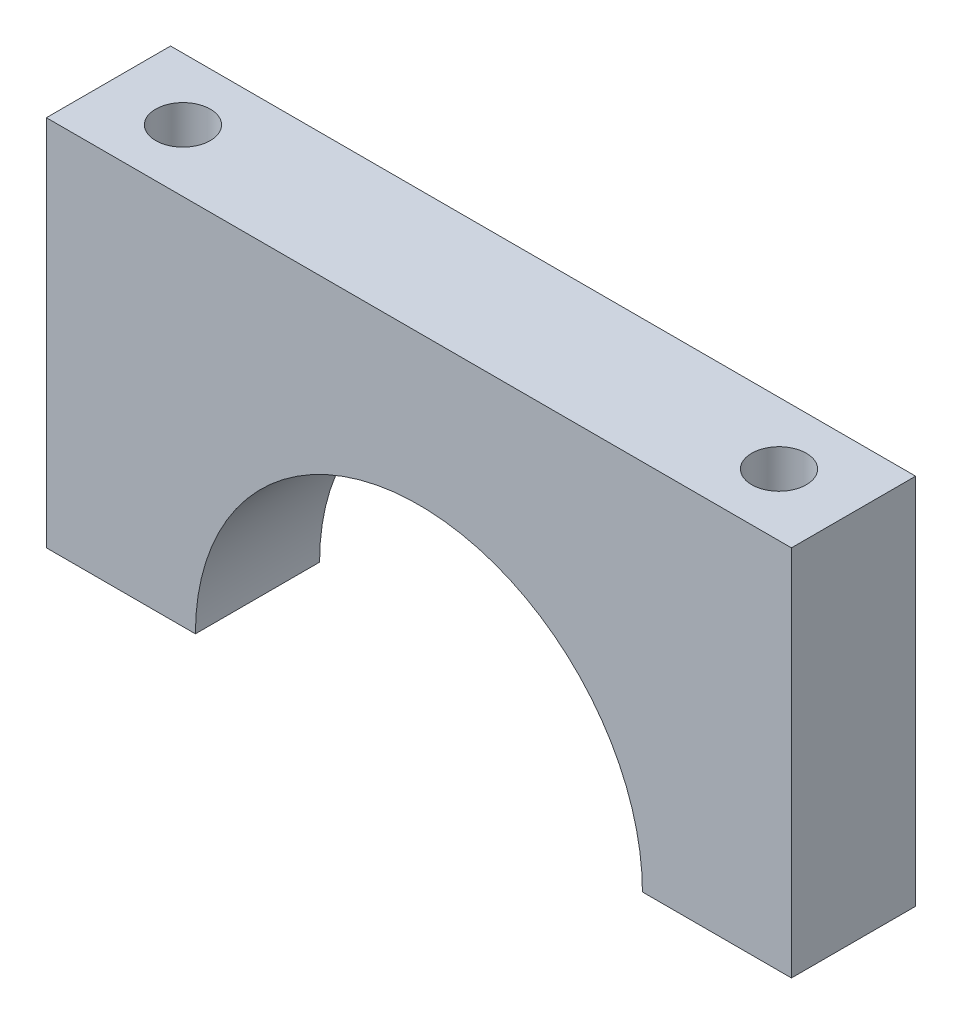
ISO-10303-21;
HEADER;
FILE_DESCRIPTION(('STEP AP214'),'2;1');
FILE_NAME('part.step','',(''),(''),'','','');
FILE_SCHEMA(('AUTOMOTIVE_DESIGN { 1 0 10303 214 1 1 1 1 }'));
ENDSEC;
DATA;
#1=APPLICATION_CONTEXT('core data for automotive mechanical design processes');
#2=APPLICATION_PROTOCOL_DEFINITION('international standard','automotive_design',2000,#1);
#3=PRODUCT_CONTEXT('',#1,'mechanical');
#4=PRODUCT('Part','Part','',(#3));
#5=PRODUCT_RELATED_PRODUCT_CATEGORY('part','',(#4));
#6=PRODUCT_DEFINITION_FORMATION('','',#4);
#7=PRODUCT_DEFINITION_CONTEXT('part definition',#1,'design');
#8=PRODUCT_DEFINITION('design','',#6,#7);
#9=PRODUCT_DEFINITION_SHAPE('','',#8);
#10=(LENGTH_UNIT() NAMED_UNIT(*) SI_UNIT(.MILLI.,.METRE.));
#11=(NAMED_UNIT(*) PLANE_ANGLE_UNIT() SI_UNIT($,.RADIAN.));
#12=(NAMED_UNIT(*) SI_UNIT($,.STERADIAN.) SOLID_ANGLE_UNIT());
#13=UNCERTAINTY_MEASURE_WITH_UNIT(LENGTH_MEASURE(1.E-05),#10,'distance_accuracy_value','');
#14=(GEOMETRIC_REPRESENTATION_CONTEXT(3) GLOBAL_UNCERTAINTY_ASSIGNED_CONTEXT((#13)) GLOBAL_UNIT_ASSIGNED_CONTEXT((#10,
#11,#12)) REPRESENTATION_CONTEXT('',''));
#15=CARTESIAN_POINT('',(0.,0.,0.));
#16=DIRECTION('',(0.,0.,1.));
#17=DIRECTION('',(1.,0.,0.));
#18=AXIS2_PLACEMENT_3D('',#15,#16,#17);
#19=CARTESIAN_POINT('',(-15.,15.,5.));
#20=DIRECTION('',(0.,-1.,0.));
#21=DIRECTION('',(1.,0.,0.));
#22=AXIS2_PLACEMENT_3D('',#19,#20,#21);
#23=PLANE('',#22);
#24=DIRECTION('',(-1.,0.,0.));
#25=VECTOR('',#24,1.);
#26=CARTESIAN_POINT('',(-15.,15.,0.));
#27=LINE('',#26,#25);
#28=CARTESIAN_POINT('',(15.,15.,0.));
#29=VERTEX_POINT('',#28);
#30=CARTESIAN_POINT('',(-15.,15.,0.));
#31=VERTEX_POINT('',#30);
#32=EDGE_CURVE('E230',#29,#31,#27,.T.);
#33=ORIENTED_EDGE('',*,*,#32,.T.);
#34=DIRECTION('',(0.,0.,-1.));
#35=VECTOR('',#34,1.);
#36=CARTESIAN_POINT('',(-15.,15.,5.));
#37=LINE('',#36,#35);
#38=CARTESIAN_POINT('',(-15.,15.,5.));
#39=VERTEX_POINT('',#38);
#40=EDGE_CURVE('E60',#39,#31,#37,.T.);
#41=ORIENTED_EDGE('',*,*,#40,.F.);
#42=DIRECTION('',(-1.,0.,0.));
#43=VECTOR('',#42,1.);
#44=CARTESIAN_POINT('',(-15.,15.,5.));
#45=LINE('',#44,#43);
#46=CARTESIAN_POINT('',(15.,15.,5.));
#47=VERTEX_POINT('',#46);
#48=EDGE_CURVE('E220',#47,#39,#45,.T.);
#49=ORIENTED_EDGE('',*,*,#48,.F.);
#50=DIRECTION('',(0.,0.,-1.));
#51=VECTOR('',#50,1.);
#52=CARTESIAN_POINT('',(15.,15.,5.));
#53=LINE('',#52,#51);
#54=EDGE_CURVE('E11',#47,#29,#53,.T.);
#55=ORIENTED_EDGE('',*,*,#54,.T.);
#56=EDGE_LOOP('',(#33,#41,#49,#55));
#57=FACE_BOUND('',#56,.T.);
#58=CARTESIAN_POINT('',(12.,15.000012,2.5));
#59=DIRECTION('',(0.,1.,0.));
#60=DIRECTION('',(-1.,0.,0.));
#61=AXIS2_PLACEMENT_3D('',#58,#59,#60);
#62=CIRCLE('',#61,1.1);
#63=CARTESIAN_POINT('',(10.9,15.000012,2.5));
#64=VERTEX_POINT('',#63);
#65=EDGE_CURVE('E161',#64,#64,#62,.T.);
#66=ORIENTED_EDGE('',*,*,#65,.F.);
#67=EDGE_LOOP('',(#66));
#68=FACE_BOUND('',#67,.T.);
#69=CARTESIAN_POINT('',(-12.,15.000012,2.49999999999932));
#70=DIRECTION('',(0.,1.,0.));
#71=DIRECTION('',(-1.,0.,0.));
#72=AXIS2_PLACEMENT_3D('',#69,#70,#71);
#73=CIRCLE('',#72,1.1);
#74=CARTESIAN_POINT('',(-13.1,15.000012,2.49999999999932));
#75=VERTEX_POINT('',#74);
#76=EDGE_CURVE('E248',#75,#75,#73,.T.);
#77=ORIENTED_EDGE('',*,*,#76,.F.);
#78=EDGE_LOOP('',(#77));
#79=FACE_BOUND('',#78,.T.);
#80=ADVANCED_FACE('F44',(#57,#68,#79),#23,.F.);
#81=CARTESIAN_POINT('',(15.,0.,5.));
#82=DIRECTION('',(-1.,0.,0.));
#83=DIRECTION('',(0.,-1.,0.));
#84=AXIS2_PLACEMENT_3D('',#81,#82,#83);
#85=PLANE('',#84);
#86=DIRECTION('',(0.,1.,0.));
#87=VECTOR('',#86,1.);
#88=CARTESIAN_POINT('',(15.,0.,0.));
#89=LINE('',#88,#87);
#90=CARTESIAN_POINT('',(15.,0.,0.));
#91=VERTEX_POINT('',#90);
#92=EDGE_CURVE('E222',#91,#29,#89,.T.);
#93=ORIENTED_EDGE('',*,*,#92,.T.);
#94=ORIENTED_EDGE('',*,*,#54,.F.);
#95=DIRECTION('',(0.,1.,0.));
#96=VECTOR('',#95,1.);
#97=CARTESIAN_POINT('',(15.,0.,5.));
#98=LINE('',#97,#96);
#99=CARTESIAN_POINT('',(15.,0.,5.));
#100=VERTEX_POINT('',#99);
#101=EDGE_CURVE('E115',#100,#47,#98,.T.);
#102=ORIENTED_EDGE('',*,*,#101,.F.);
#103=DIRECTION('',(0.,0.,-1.));
#104=VECTOR('',#103,1.);
#105=CARTESIAN_POINT('',(15.,0.,5.));
#106=LINE('',#105,#104);
#107=EDGE_CURVE('E155',#100,#91,#106,.T.);
#108=ORIENTED_EDGE('',*,*,#107,.T.);
#109=EDGE_LOOP('',(#93,#94,#102,#108));
#110=FACE_BOUND('',#109,.T.);
#111=ADVANCED_FACE('F50',(#110),#85,.F.);
#112=CARTESIAN_POINT('',(-15.,0.,5.));
#113=DIRECTION('',(1.,0.,0.));
#114=DIRECTION('',(0.,0.,-1.));
#115=AXIS2_PLACEMENT_3D('',#112,#113,#114);
#116=PLANE('',#115);
#117=DIRECTION('',(0.,-1.,0.));
#118=VECTOR('',#117,1.);
#119=CARTESIAN_POINT('',(-15.,0.,0.));
#120=LINE('',#119,#118);
#121=CARTESIAN_POINT('',(-15.,0.,0.));
#122=VERTEX_POINT('',#121);
#123=EDGE_CURVE('E235',#31,#122,#120,.T.);
#124=ORIENTED_EDGE('',*,*,#123,.T.);
#125=DIRECTION('',(0.,0.,-1.));
#126=VECTOR('',#125,1.);
#127=CARTESIAN_POINT('',(-15.,0.,5.));
#128=LINE('',#127,#126);
#129=CARTESIAN_POINT('',(-15.,0.,5.));
#130=VERTEX_POINT('',#129);
#131=EDGE_CURVE('E149',#130,#122,#128,.T.);
#132=ORIENTED_EDGE('',*,*,#131,.F.);
#133=DIRECTION('',(0.,-1.,0.));
#134=VECTOR('',#133,1.);
#135=CARTESIAN_POINT('',(-15.,0.,5.));
#136=LINE('',#135,#134);
#137=EDGE_CURVE('E137',#39,#130,#136,.T.);
#138=ORIENTED_EDGE('',*,*,#137,.F.);
#139=ORIENTED_EDGE('',*,*,#40,.T.);
#140=EDGE_LOOP('',(#124,#132,#138,#139));
#141=FACE_BOUND('',#140,.T.);
#142=ADVANCED_FACE('F178',(#141),#116,.F.);
#143=CARTESIAN_POINT('',(-15.,0.,5.));
#144=DIRECTION('',(0.,1.,0.));
#145=DIRECTION('',(-1.,0.,0.));
#146=AXIS2_PLACEMENT_3D('',#143,#144,#145);
#147=PLANE('',#146);
#148=CARTESIAN_POINT('',(-12.,0.,2.49999999999932));
#149=DIRECTION('',(0.,1.,0.));
#150=DIRECTION('',(-1.,0.,0.));
#151=AXIS2_PLACEMENT_3D('',#148,#149,#150);
#152=CIRCLE('',#151,1.1);
#153=CARTESIAN_POINT('',(-13.1,0.,2.49999999999932));
#154=VERTEX_POINT('',#153);
#155=EDGE_CURVE('E228',#154,#154,#152,.T.);
#156=ORIENTED_EDGE('',*,*,#155,.T.);
#157=EDGE_LOOP('',(#156));
#158=FACE_BOUND('',#157,.T.);
#159=DIRECTION('',(1.,0.,0.));
#160=VECTOR('',#159,1.);
#161=CARTESIAN_POINT('',(-15.,0.,0.));
#162=LINE('',#161,#160);
#163=CARTESIAN_POINT('',(-9.,0.,0.));
#164=VERTEX_POINT('',#163);
#165=EDGE_CURVE('E147',#122,#164,#162,.T.);
#166=ORIENTED_EDGE('',*,*,#165,.T.);
#167=DIRECTION('',(0.,0.,-1.));
#168=VECTOR('',#167,1.);
#169=CARTESIAN_POINT('',(-9.,0.,5.));
#170=LINE('',#169,#168);
#171=CARTESIAN_POINT('',(-9.,0.,5.));
#172=VERTEX_POINT('',#171);
#173=EDGE_CURVE('E131',#172,#164,#170,.T.);
#174=ORIENTED_EDGE('',*,*,#173,.F.);
#175=DIRECTION('',(1.,0.,0.));
#176=VECTOR('',#175,1.);
#177=CARTESIAN_POINT('',(-15.,0.,5.));
#178=LINE('',#177,#176);
#179=EDGE_CURVE('E134',#130,#172,#178,.T.);
#180=ORIENTED_EDGE('',*,*,#179,.F.);
#181=ORIENTED_EDGE('',*,*,#131,.T.);
#182=EDGE_LOOP('',(#166,#174,#180,#181));
#183=FACE_BOUND('',#182,.T.);
#184=ADVANCED_FACE('F144',(#158,#183),#147,.F.);
#185=CARTESIAN_POINT('',(0.,0.,5.));
#186=DIRECTION('',(0.,0.,-1.));
#187=DIRECTION('',(-1.,0.,0.));
#188=AXIS2_PLACEMENT_3D('',#185,#186,#187);
#189=CYLINDRICAL_SURFACE('',#188,9.);
#190=CARTESIAN_POINT('',(0.,0.,0.));
#191=DIRECTION('',(0.,0.,-1.));
#192=DIRECTION('',(1.,0.,0.));
#193=AXIS2_PLACEMENT_3D('',#190,#191,#192);
#194=CIRCLE('',#193,9.);
#195=CARTESIAN_POINT('',(9.,0.,0.));
#196=VERTEX_POINT('',#195);
#197=EDGE_CURVE('E239',#164,#196,#194,.T.);
#198=ORIENTED_EDGE('',*,*,#197,.T.);
#199=DIRECTION('',(0.,0.,-1.));
#200=VECTOR('',#199,1.);
#201=CARTESIAN_POINT('',(9.,0.,5.));
#202=LINE('',#201,#200);
#203=CARTESIAN_POINT('',(9.,0.,5.));
#204=VERTEX_POINT('',#203);
#205=EDGE_CURVE('E133',#204,#196,#202,.T.);
#206=ORIENTED_EDGE('',*,*,#205,.F.);
#207=CARTESIAN_POINT('',(0.,0.,5.));
#208=DIRECTION('',(0.,0.,-1.));
#209=DIRECTION('',(1.,0.,0.));
#210=AXIS2_PLACEMENT_3D('',#207,#208,#209);
#211=CIRCLE('',#210,9.);
#212=EDGE_CURVE('E128',#172,#204,#211,.T.);
#213=ORIENTED_EDGE('',*,*,#212,.F.);
#214=ORIENTED_EDGE('',*,*,#173,.T.);
#215=EDGE_LOOP('',(#198,#206,#213,#214));
#216=FACE_BOUND('',#215,.T.);
#217=ADVANCED_FACE('F129',(#216),#189,.F.);
#218=CARTESIAN_POINT('',(9.,0.,5.));
#219=DIRECTION('',(0.,1.,0.));
#220=DIRECTION('',(0.,0.,1.));
#221=AXIS2_PLACEMENT_3D('',#218,#219,#220);
#222=PLANE('',#221);
#223=CARTESIAN_POINT('',(12.,0.,2.5));
#224=DIRECTION('',(0.,1.,0.));
#225=DIRECTION('',(-1.,0.,0.));
#226=AXIS2_PLACEMENT_3D('',#223,#224,#225);
#227=CIRCLE('',#226,1.1);
#228=CARTESIAN_POINT('',(10.9,0.,2.5));
#229=VERTEX_POINT('',#228);
#230=EDGE_CURVE('E260',#229,#229,#227,.T.);
#231=ORIENTED_EDGE('',*,*,#230,.T.);
#232=EDGE_LOOP('',(#231));
#233=FACE_BOUND('',#232,.T.);
#234=DIRECTION('',(1.,0.,0.));
#235=VECTOR('',#234,1.);
#236=CARTESIAN_POINT('',(9.,0.,0.));
#237=LINE('',#236,#235);
#238=EDGE_CURVE('E98',#196,#91,#237,.T.);
#239=ORIENTED_EDGE('',*,*,#238,.T.);
#240=ORIENTED_EDGE('',*,*,#107,.F.);
#241=DIRECTION('',(1.,0.,0.));
#242=VECTOR('',#241,1.);
#243=CARTESIAN_POINT('',(9.,0.,5.));
#244=LINE('',#243,#242);
#245=EDGE_CURVE('E68',#204,#100,#244,.T.);
#246=ORIENTED_EDGE('',*,*,#245,.F.);
#247=ORIENTED_EDGE('',*,*,#205,.T.);
#248=EDGE_LOOP('',(#239,#240,#246,#247));
#249=FACE_BOUND('',#248,.T.);
#250=ADVANCED_FACE('F187',(#233,#249),#222,.F.);
#251=CARTESIAN_POINT('',(0.,0.,5.));
#252=DIRECTION('',(0.,0.,1.));
#253=DIRECTION('',(1.,0.,0.));
#254=AXIS2_PLACEMENT_3D('',#251,#252,#253);
#255=PLANE('',#254);
#256=ORIENTED_EDGE('',*,*,#101,.T.);
#257=ORIENTED_EDGE('',*,*,#48,.T.);
#258=ORIENTED_EDGE('',*,*,#137,.T.);
#259=ORIENTED_EDGE('',*,*,#179,.T.);
#260=ORIENTED_EDGE('',*,*,#212,.T.);
#261=ORIENTED_EDGE('',*,*,#245,.T.);
#262=EDGE_LOOP('',(#256,#257,#258,#259,#260,#261));
#263=FACE_BOUND('',#262,.T.);
#264=ADVANCED_FACE('F138',(#263),#255,.T.);
#265=CARTESIAN_POINT('',(0.,0.,0.));
#266=DIRECTION('',(0.,0.,1.));
#267=DIRECTION('',(1.,0.,0.));
#268=AXIS2_PLACEMENT_3D('',#265,#266,#267);
#269=PLANE('',#268);
#270=ORIENTED_EDGE('',*,*,#92,.F.);
#271=ORIENTED_EDGE('',*,*,#238,.F.);
#272=ORIENTED_EDGE('',*,*,#197,.F.);
#273=ORIENTED_EDGE('',*,*,#165,.F.);
#274=ORIENTED_EDGE('',*,*,#123,.F.);
#275=ORIENTED_EDGE('',*,*,#32,.F.);
#276=EDGE_LOOP('',(#270,#271,#272,#273,#274,#275));
#277=FACE_BOUND('',#276,.T.);
#278=ADVANCED_FACE('F195',(#277),#269,.F.);
#279=CARTESIAN_POINT('',(12.,0.,2.5));
#280=DIRECTION('',(0.,1.,0.));
#281=DIRECTION('',(-1.,0.,0.));
#282=AXIS2_PLACEMENT_3D('',#279,#280,#281);
#283=CYLINDRICAL_SURFACE('',#282,1.1);
#284=ORIENTED_EDGE('',*,*,#230,.F.);
#285=EDGE_LOOP('',(#284));
#286=FACE_BOUND('',#285,.T.);
#287=ORIENTED_EDGE('',*,*,#65,.T.);
#288=EDGE_LOOP('',(#287));
#289=FACE_BOUND('',#288,.T.);
#290=ADVANCED_FACE('F193',(#286,#289),#283,.F.);
#291=CARTESIAN_POINT('',(-12.,0.,2.49999999999932));
#292=DIRECTION('',(0.,1.,0.));
#293=DIRECTION('',(-1.,0.,0.));
#294=AXIS2_PLACEMENT_3D('',#291,#292,#293);
#295=CYLINDRICAL_SURFACE('',#294,1.1);
#296=ORIENTED_EDGE('',*,*,#155,.F.);
#297=EDGE_LOOP('',(#296));
#298=FACE_BOUND('',#297,.T.);
#299=ORIENTED_EDGE('',*,*,#76,.T.);
#300=EDGE_LOOP('',(#299));
#301=FACE_BOUND('',#300,.T.);
#302=ADVANCED_FACE('F202',(#298,#301),#295,.F.);
#303=CLOSED_SHELL('',(#80,#111,#142,#184,#217,#250,#264,#278,#290,#302));
#304=MANIFOLD_SOLID_BREP('B2',#303);
#305=ADVANCED_BREP_SHAPE_REPRESENTATION('',(#18,#304),#14);
#306=SHAPE_DEFINITION_REPRESENTATION(#9,#305);
ENDSEC;
END-ISO-10303-21;
